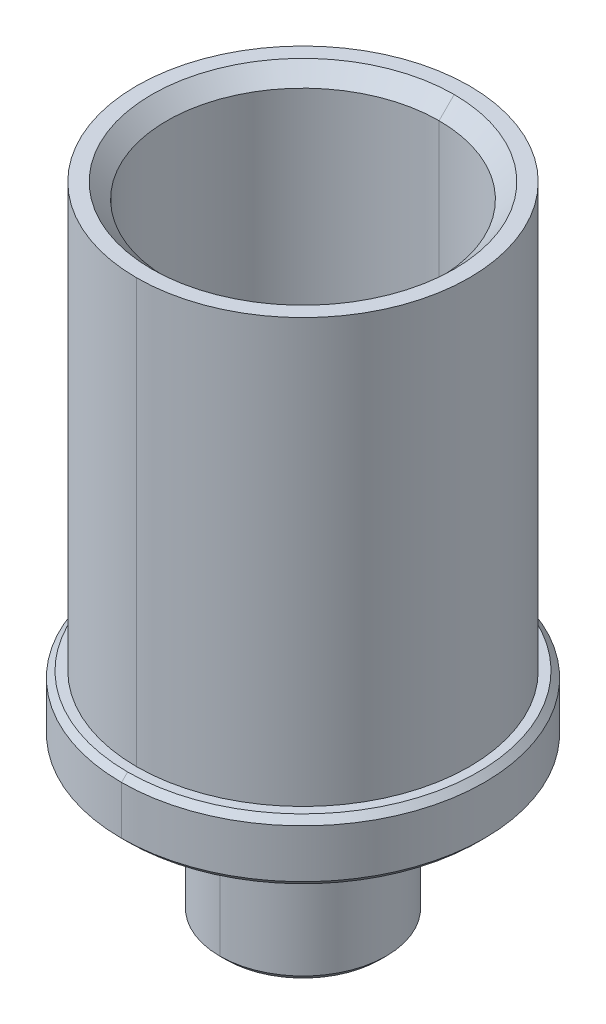
ISO-10303-21;
HEADER;
FILE_DESCRIPTION(('STEP AP214'),'2;1');
FILE_NAME('part.step','',(''),(''),'','','');
FILE_SCHEMA(('AUTOMOTIVE_DESIGN { 1 0 10303 214 1 1 1 1 }'));
ENDSEC;
DATA;
#1=APPLICATION_CONTEXT('core data for automotive mechanical design processes');
#2=APPLICATION_PROTOCOL_DEFINITION('international standard','automotive_design',2000,#1);
#3=PRODUCT_CONTEXT('',#1,'mechanical');
#4=PRODUCT('Part','Part','',(#3));
#5=PRODUCT_RELATED_PRODUCT_CATEGORY('part','',(#4));
#6=PRODUCT_DEFINITION_FORMATION('','',#4);
#7=PRODUCT_DEFINITION_CONTEXT('part definition',#1,'design');
#8=PRODUCT_DEFINITION('design','',#6,#7);
#9=PRODUCT_DEFINITION_SHAPE('','',#8);
#10=(LENGTH_UNIT() NAMED_UNIT(*) SI_UNIT(.MILLI.,.METRE.));
#11=(NAMED_UNIT(*) PLANE_ANGLE_UNIT() SI_UNIT($,.RADIAN.));
#12=(NAMED_UNIT(*) SI_UNIT($,.STERADIAN.) SOLID_ANGLE_UNIT());
#13=UNCERTAINTY_MEASURE_WITH_UNIT(LENGTH_MEASURE(1.E-05),#10,'distance_accuracy_value','');
#14=(GEOMETRIC_REPRESENTATION_CONTEXT(3) GLOBAL_UNCERTAINTY_ASSIGNED_CONTEXT((#13)) GLOBAL_UNIT_ASSIGNED_CONTEXT((#10,
#11,#12)) REPRESENTATION_CONTEXT('',''));
#15=CARTESIAN_POINT('',(0.,0.,0.));
#16=DIRECTION('',(0.,0.,1.));
#17=DIRECTION('',(1.,0.,0.));
#18=AXIS2_PLACEMENT_3D('',#15,#16,#17);
#19=CARTESIAN_POINT('',(0.,7.,0.));
#20=DIRECTION('',(0.,1.,0.));
#21=DIRECTION('',(0.,0.,1.));
#22=AXIS2_PLACEMENT_3D('',#19,#20,#21);
#23=CONICAL_SURFACE('',#22,2.5,0.785398163397448);
#24=DIRECTION('',(0.,0.707106781186548,-0.707106781186547));
#25=VECTOR('',#24,1.);
#26=CARTESIAN_POINT('',(0.,7.,-2.5));
#27=LINE('',#26,#25);
#28=CARTESIAN_POINT('',(0.,6.75,-2.25));
#29=VERTEX_POINT('',#28);
#30=CARTESIAN_POINT('',(0.,7.,-2.5));
#31=VERTEX_POINT('',#30);
#32=EDGE_CURVE('E159',#29,#31,#27,.T.);
#33=ORIENTED_EDGE('',*,*,#32,.F.);
#34=CARTESIAN_POINT('',(0.,6.75,0.));
#35=DIRECTION('',(0.,1.,0.));
#36=DIRECTION('',(0.,0.,-1.));
#37=AXIS2_PLACEMENT_3D('',#34,#35,#36);
#38=CIRCLE('',#37,2.25);
#39=CARTESIAN_POINT('',(0.,6.75,2.25));
#40=VERTEX_POINT('',#39);
#41=EDGE_CURVE('E136',#40,#29,#38,.T.);
#42=ORIENTED_EDGE('',*,*,#41,.F.);
#43=DIRECTION('',(0.,0.707106781186548,0.707106781186547));
#44=VECTOR('',#43,1.);
#45=CARTESIAN_POINT('',(0.,7.,2.5));
#46=LINE('',#45,#44);
#47=CARTESIAN_POINT('',(0.,7.,2.5));
#48=VERTEX_POINT('',#47);
#49=EDGE_CURVE('E168',#40,#48,#46,.T.);
#50=ORIENTED_EDGE('',*,*,#49,.T.);
#51=CARTESIAN_POINT('',(0.,7.,0.));
#52=DIRECTION('',(0.,-1.,0.));
#53=DIRECTION('',(0.,0.,-1.));
#54=AXIS2_PLACEMENT_3D('',#51,#52,#53);
#55=CIRCLE('',#54,2.5);
#56=EDGE_CURVE('E160',#31,#48,#55,.T.);
#57=ORIENTED_EDGE('',*,*,#56,.F.);
#58=EDGE_LOOP('',(#33,#42,#50,#57));
#59=FACE_BOUND('',#58,.T.);
#60=ADVANCED_FACE('F17',(#59),#23,.F.);
#61=CARTESIAN_POINT('',(0.,-0.1,0.));
#62=DIRECTION('',(0.,-1.,0.));
#63=DIRECTION('',(0.,0.,-1.));
#64=AXIS2_PLACEMENT_3D('',#61,#62,#63);
#65=CONICAL_SURFACE('',#64,3.,0.785398163397446);
#66=DIRECTION('',(0.,-0.707106781186549,0.707106781186546));
#67=VECTOR('',#66,1.);
#68=CARTESIAN_POINT('',(0.,-0.1,3.));
#69=LINE('',#68,#67);
#70=CARTESIAN_POINT('',(0.,0.,2.9));
#71=VERTEX_POINT('',#70);
#72=CARTESIAN_POINT('',(0.,-0.1,3.));
#73=VERTEX_POINT('',#72);
#74=EDGE_CURVE('E186',#71,#73,#69,.T.);
#75=ORIENTED_EDGE('',*,*,#74,.F.);
#76=CARTESIAN_POINT('',(0.,0.,0.));
#77=DIRECTION('',(0.,1.,0.));
#78=DIRECTION('',(0.,0.,-1.));
#79=AXIS2_PLACEMENT_3D('',#76,#77,#78);
#80=CIRCLE('',#79,2.9);
#81=CARTESIAN_POINT('',(0.,0.,-2.9));
#82=VERTEX_POINT('',#81);
#83=EDGE_CURVE('E233',#82,#71,#80,.T.);
#84=ORIENTED_EDGE('',*,*,#83,.F.);
#85=DIRECTION('',(0.,-0.707106781186549,-0.707106781186546));
#86=VECTOR('',#85,1.);
#87=CARTESIAN_POINT('',(0.,-0.1,-3.));
#88=LINE('',#87,#86);
#89=CARTESIAN_POINT('',(0.,-0.1,-3.));
#90=VERTEX_POINT('',#89);
#91=EDGE_CURVE('E174',#82,#90,#88,.T.);
#92=ORIENTED_EDGE('',*,*,#91,.T.);
#93=CARTESIAN_POINT('',(0.,-0.1,0.));
#94=DIRECTION('',(0.,-1.,0.));
#95=DIRECTION('',(0.,0.,-1.));
#96=AXIS2_PLACEMENT_3D('',#93,#94,#95);
#97=CIRCLE('',#96,3.);
#98=EDGE_CURVE('E229',#73,#90,#97,.T.);
#99=ORIENTED_EDGE('',*,*,#98,.F.);
#100=EDGE_LOOP('',(#75,#84,#92,#99));
#101=FACE_BOUND('',#100,.T.);
#102=ADVANCED_FACE('F19',(#101),#65,.T.);
#103=CARTESIAN_POINT('',(0.,-1.,0.));
#104=DIRECTION('',(0.,1.,0.));
#105=DIRECTION('',(0.,0.,1.));
#106=AXIS2_PLACEMENT_3D('',#103,#104,#105);
#107=CONICAL_SURFACE('',#106,2.9,0.785398163397446);
#108=DIRECTION('',(0.,0.707106781186549,-0.707106781186546));
#109=VECTOR('',#108,1.);
#110=CARTESIAN_POINT('',(0.,-1.,-2.9));
#111=LINE('',#110,#109);
#112=CARTESIAN_POINT('',(0.,-1.,-2.9));
#113=VERTEX_POINT('',#112);
#114=CARTESIAN_POINT('',(0.,-0.9,-3.));
#115=VERTEX_POINT('',#114);
#116=EDGE_CURVE('E198',#113,#115,#111,.T.);
#117=ORIENTED_EDGE('',*,*,#116,.F.);
#118=CARTESIAN_POINT('',(0.,-1.,0.));
#119=DIRECTION('',(0.,-1.,0.));
#120=DIRECTION('',(0.,0.,1.));
#121=AXIS2_PLACEMENT_3D('',#118,#119,#120);
#122=CIRCLE('',#121,2.9);
#123=CARTESIAN_POINT('',(0.,-1.,2.9));
#124=VERTEX_POINT('',#123);
#125=EDGE_CURVE('E284',#124,#113,#122,.T.);
#126=ORIENTED_EDGE('',*,*,#125,.F.);
#127=DIRECTION('',(0.,0.707106781186549,0.707106781186546));
#128=VECTOR('',#127,1.);
#129=CARTESIAN_POINT('',(0.,-1.,2.9));
#130=LINE('',#129,#128);
#131=CARTESIAN_POINT('',(0.,-0.9,3.));
#132=VERTEX_POINT('',#131);
#133=EDGE_CURVE('E206',#124,#132,#130,.T.);
#134=ORIENTED_EDGE('',*,*,#133,.T.);
#135=CARTESIAN_POINT('',(0.,-0.9,0.));
#136=DIRECTION('',(0.,1.,0.));
#137=DIRECTION('',(0.,0.,1.));
#138=AXIS2_PLACEMENT_3D('',#135,#136,#137);
#139=CIRCLE('',#138,3.);
#140=EDGE_CURVE('E232',#115,#132,#139,.T.);
#141=ORIENTED_EDGE('',*,*,#140,.F.);
#142=EDGE_LOOP('',(#117,#126,#134,#141));
#143=FACE_BOUND('',#142,.T.);
#144=ADVANCED_FACE('F301',(#143),#107,.T.);
#145=CARTESIAN_POINT('',(0.,-3.5,0.));
#146=DIRECTION('',(0.,1.,0.));
#147=DIRECTION('',(0.,0.,1.));
#148=AXIS2_PLACEMENT_3D('',#145,#146,#147);
#149=CONICAL_SURFACE('',#148,1.275,0.785398163397446);
#150=DIRECTION('',(0.,0.707106781186549,-0.707106781186546));
#151=VECTOR('',#150,1.);
#152=CARTESIAN_POINT('',(0.,-3.5,-1.275));
#153=LINE('',#152,#151);
#154=CARTESIAN_POINT('',(0.,-3.5,-1.275));
#155=VERTEX_POINT('',#154);
#156=CARTESIAN_POINT('',(0.,-3.4,-1.375));
#157=VERTEX_POINT('',#156);
#158=EDGE_CURVE('E207',#155,#157,#153,.T.);
#159=ORIENTED_EDGE('',*,*,#158,.F.);
#160=CARTESIAN_POINT('',(0.,-3.5,0.));
#161=DIRECTION('',(0.,-1.,0.));
#162=DIRECTION('',(0.,0.,1.));
#163=AXIS2_PLACEMENT_3D('',#160,#161,#162);
#164=CIRCLE('',#163,1.275);
#165=CARTESIAN_POINT('',(0.,-3.5,1.275));
#166=VERTEX_POINT('',#165);
#167=EDGE_CURVE('E11',#166,#155,#164,.T.);
#168=ORIENTED_EDGE('',*,*,#167,.F.);
#169=DIRECTION('',(0.,0.707106781186549,0.707106781186546));
#170=VECTOR('',#169,1.);
#171=CARTESIAN_POINT('',(0.,-3.5,1.275));
#172=LINE('',#171,#170);
#173=CARTESIAN_POINT('',(0.,-3.4,1.375));
#174=VERTEX_POINT('',#173);
#175=EDGE_CURVE('E218',#166,#174,#172,.T.);
#176=ORIENTED_EDGE('',*,*,#175,.T.);
#177=CARTESIAN_POINT('',(0.,-3.4,0.));
#178=DIRECTION('',(0.,1.,0.));
#179=DIRECTION('',(0.,0.,1.));
#180=AXIS2_PLACEMENT_3D('',#177,#178,#179);
#181=CIRCLE('',#180,1.375);
#182=EDGE_CURVE('E27',#157,#174,#181,.T.);
#183=ORIENTED_EDGE('',*,*,#182,.F.);
#184=EDGE_LOOP('',(#159,#168,#176,#183));
#185=FACE_BOUND('',#184,.T.);
#186=ADVANCED_FACE('F568',(#185),#149,.T.);
#187=CARTESIAN_POINT('',(-1.375,-3.5,0.));
#188=DIRECTION('',(0.,1.,0.));
#189=DIRECTION('',(1.,0.,0.));
#190=AXIS2_PLACEMENT_3D('',#187,#188,#189);
#191=PLANE('',#190);
#192=ORIENTED_EDGE('',*,*,#167,.T.);
#193=CARTESIAN_POINT('',(0.,-3.5,0.));
#194=DIRECTION('',(0.,-1.,0.));
#195=DIRECTION('',(0.,0.,1.));
#196=AXIS2_PLACEMENT_3D('',#193,#194,#195);
#197=CIRCLE('',#196,1.275);
#198=EDGE_CURVE('E212',#155,#166,#197,.T.);
#199=ORIENTED_EDGE('',*,*,#198,.T.);
#200=EDGE_LOOP('',(#192,#199));
#201=FACE_BOUND('',#200,.T.);
#202=ADVANCED_FACE('F318',(#201),#191,.F.);
#203=CARTESIAN_POINT('',(0.,-3.5,0.));
#204=DIRECTION('',(0.,-1.,0.));
#205=DIRECTION('',(0.,0.,-1.));
#206=AXIS2_PLACEMENT_3D('',#203,#204,#205);
#207=CYLINDRICAL_SURFACE('',#206,1.375);
#208=DIRECTION('',(0.,-1.,0.));
#209=VECTOR('',#208,1.);
#210=CARTESIAN_POINT('',(0.,-3.5,1.375));
#211=LINE('',#210,#209);
#212=CARTESIAN_POINT('',(0.,-1.,1.375));
#213=VERTEX_POINT('',#212);
#214=EDGE_CURVE('E237',#213,#174,#211,.T.);
#215=ORIENTED_EDGE('',*,*,#214,.F.);
#216=CARTESIAN_POINT('',(0.,-1.,0.));
#217=DIRECTION('',(0.,-1.,0.));
#218=DIRECTION('',(0.,0.,-1.));
#219=AXIS2_PLACEMENT_3D('',#216,#217,#218);
#220=CIRCLE('',#219,1.375);
#221=CARTESIAN_POINT('',(0.,-1.,-1.375));
#222=VERTEX_POINT('',#221);
#223=EDGE_CURVE('E21',#213,#222,#220,.T.);
#224=ORIENTED_EDGE('',*,*,#223,.T.);
#225=DIRECTION('',(0.,-1.,0.));
#226=VECTOR('',#225,1.);
#227=CARTESIAN_POINT('',(0.,-3.5,-1.375));
#228=LINE('',#227,#226);
#229=EDGE_CURVE('E241',#222,#157,#228,.T.);
#230=ORIENTED_EDGE('',*,*,#229,.T.);
#231=ORIENTED_EDGE('',*,*,#182,.T.);
#232=EDGE_LOOP('',(#215,#224,#230,#231));
#233=FACE_BOUND('',#232,.T.);
#234=ADVANCED_FACE('F308',(#233),#207,.T.);
#235=CARTESIAN_POINT('',(-3.,-1.,0.));
#236=DIRECTION('',(0.,1.,0.));
#237=DIRECTION('',(1.,0.,0.));
#238=AXIS2_PLACEMENT_3D('',#235,#236,#237);
#239=PLANE('',#238);
#240=CARTESIAN_POINT('',(0.,-1.,0.));
#241=DIRECTION('',(0.,-1.,0.));
#242=DIRECTION('',(0.,0.,-1.));
#243=AXIS2_PLACEMENT_3D('',#240,#241,#242);
#244=CIRCLE('',#243,1.375);
#245=EDGE_CURVE('E222',#222,#213,#244,.T.);
#246=ORIENTED_EDGE('',*,*,#245,.F.);
#247=ORIENTED_EDGE('',*,*,#223,.F.);
#248=EDGE_LOOP('',(#246,#247));
#249=FACE_BOUND('',#248,.T.);
#250=ORIENTED_EDGE('',*,*,#125,.T.);
#251=CARTESIAN_POINT('',(0.,-1.,0.));
#252=DIRECTION('',(0.,-1.,0.));
#253=DIRECTION('',(0.,0.,1.));
#254=AXIS2_PLACEMENT_3D('',#251,#252,#253);
#255=CIRCLE('',#254,2.9);
#256=EDGE_CURVE('E178',#113,#124,#255,.T.);
#257=ORIENTED_EDGE('',*,*,#256,.T.);
#258=EDGE_LOOP('',(#250,#257));
#259=FACE_BOUND('',#258,.T.);
#260=ADVANCED_FACE('F306',(#249,#259),#239,.F.);
#261=CARTESIAN_POINT('',(0.,-3.5,0.));
#262=DIRECTION('',(0.,-1.,0.));
#263=DIRECTION('',(0.,0.,-1.));
#264=AXIS2_PLACEMENT_3D('',#261,#262,#263);
#265=CYLINDRICAL_SURFACE('',#264,3.);
#266=DIRECTION('',(0.,-1.,0.));
#267=VECTOR('',#266,1.);
#268=CARTESIAN_POINT('',(0.,-3.5,3.));
#269=LINE('',#268,#267);
#270=EDGE_CURVE('E245',#73,#132,#269,.T.);
#271=ORIENTED_EDGE('',*,*,#270,.F.);
#272=ORIENTED_EDGE('',*,*,#98,.T.);
#273=DIRECTION('',(0.,-1.,0.));
#274=VECTOR('',#273,1.);
#275=CARTESIAN_POINT('',(0.,-3.5,-3.));
#276=LINE('',#275,#274);
#277=EDGE_CURVE('E249',#90,#115,#276,.T.);
#278=ORIENTED_EDGE('',*,*,#277,.T.);
#279=ORIENTED_EDGE('',*,*,#140,.T.);
#280=EDGE_LOOP('',(#271,#272,#278,#279));
#281=FACE_BOUND('',#280,.T.);
#282=ADVANCED_FACE('F292',(#281),#265,.T.);
#283=CARTESIAN_POINT('',(-2.75,0.,0.));
#284=DIRECTION('',(0.,-1.,0.));
#285=DIRECTION('',(0.,0.,-1.));
#286=AXIS2_PLACEMENT_3D('',#283,#284,#285);
#287=PLANE('',#286);
#288=CARTESIAN_POINT('',(0.,0.,0.));
#289=DIRECTION('',(0.,-1.,0.));
#290=DIRECTION('',(0.,0.,-1.));
#291=AXIS2_PLACEMENT_3D('',#288,#289,#290);
#292=CIRCLE('',#291,2.75);
#293=CARTESIAN_POINT('',(0.,0.,-2.75));
#294=VERTEX_POINT('',#293);
#295=CARTESIAN_POINT('',(0.,0.,2.75));
#296=VERTEX_POINT('',#295);
#297=EDGE_CURVE('E261',#294,#296,#292,.T.);
#298=ORIENTED_EDGE('',*,*,#297,.T.);
#299=CARTESIAN_POINT('',(0.,0.,0.));
#300=DIRECTION('',(0.,-1.,0.));
#301=DIRECTION('',(0.,0.,-1.));
#302=AXIS2_PLACEMENT_3D('',#299,#300,#301);
#303=CIRCLE('',#302,2.75);
#304=EDGE_CURVE('E278',#296,#294,#303,.T.);
#305=ORIENTED_EDGE('',*,*,#304,.T.);
#306=EDGE_LOOP('',(#298,#305));
#307=FACE_BOUND('',#306,.T.);
#308=ORIENTED_EDGE('',*,*,#83,.T.);
#309=CARTESIAN_POINT('',(0.,0.,0.));
#310=DIRECTION('',(0.,1.,0.));
#311=DIRECTION('',(0.,0.,-1.));
#312=AXIS2_PLACEMENT_3D('',#309,#310,#311);
#313=CIRCLE('',#312,2.9);
#314=EDGE_CURVE('E182',#71,#82,#313,.T.);
#315=ORIENTED_EDGE('',*,*,#314,.T.);
#316=EDGE_LOOP('',(#308,#315));
#317=FACE_BOUND('',#316,.T.);
#318=ADVANCED_FACE('F316',(#307,#317),#287,.F.);
#319=CARTESIAN_POINT('',(0.,-3.5,0.));
#320=DIRECTION('',(0.,-1.,0.));
#321=DIRECTION('',(0.,0.,-1.));
#322=AXIS2_PLACEMENT_3D('',#319,#320,#321);
#323=CYLINDRICAL_SURFACE('',#322,2.75);
#324=DIRECTION('',(0.,-1.,0.));
#325=VECTOR('',#324,1.);
#326=CARTESIAN_POINT('',(0.,-3.5,2.75));
#327=LINE('',#326,#325);
#328=CARTESIAN_POINT('',(0.,7.,2.75));
#329=VERTEX_POINT('',#328);
#330=EDGE_CURVE('E257',#329,#296,#327,.T.);
#331=ORIENTED_EDGE('',*,*,#330,.F.);
#332=CARTESIAN_POINT('',(0.,7.,0.));
#333=DIRECTION('',(0.,-1.,0.));
#334=DIRECTION('',(0.,0.,-1.));
#335=AXIS2_PLACEMENT_3D('',#332,#333,#334);
#336=CIRCLE('',#335,2.75);
#337=CARTESIAN_POINT('',(0.,7.,-2.75));
#338=VERTEX_POINT('',#337);
#339=EDGE_CURVE('E148',#329,#338,#336,.T.);
#340=ORIENTED_EDGE('',*,*,#339,.T.);
#341=DIRECTION('',(0.,-1.,0.));
#342=VECTOR('',#341,1.);
#343=CARTESIAN_POINT('',(0.,-3.5,-2.75));
#344=LINE('',#343,#342);
#345=EDGE_CURVE('E267',#338,#294,#344,.T.);
#346=ORIENTED_EDGE('',*,*,#345,.T.);
#347=ORIENTED_EDGE('',*,*,#304,.F.);
#348=EDGE_LOOP('',(#331,#340,#346,#347));
#349=FACE_BOUND('',#348,.T.);
#350=ADVANCED_FACE('F334',(#349),#323,.T.);
#351=CARTESIAN_POINT('',(-2.25,7.,0.));
#352=DIRECTION('',(0.,-1.,0.));
#353=DIRECTION('',(0.,0.,-1.));
#354=AXIS2_PLACEMENT_3D('',#351,#352,#353);
#355=PLANE('',#354);
#356=CARTESIAN_POINT('',(0.,7.,0.));
#357=DIRECTION('',(0.,-1.,0.));
#358=DIRECTION('',(0.,0.,-1.));
#359=AXIS2_PLACEMENT_3D('',#356,#357,#358);
#360=CIRCLE('',#359,2.5);
#361=EDGE_CURVE('E165',#48,#31,#360,.T.);
#362=ORIENTED_EDGE('',*,*,#361,.T.);
#363=ORIENTED_EDGE('',*,*,#56,.T.);
#364=EDGE_LOOP('',(#362,#363));
#365=FACE_BOUND('',#364,.T.);
#366=CARTESIAN_POINT('',(0.,7.,0.));
#367=DIRECTION('',(0.,-1.,0.));
#368=DIRECTION('',(0.,0.,-1.));
#369=AXIS2_PLACEMENT_3D('',#366,#367,#368);
#370=CIRCLE('',#369,2.75);
#371=EDGE_CURVE('E253',#338,#329,#370,.T.);
#372=ORIENTED_EDGE('',*,*,#371,.F.);
#373=ORIENTED_EDGE('',*,*,#339,.F.);
#374=EDGE_LOOP('',(#372,#373));
#375=FACE_BOUND('',#374,.T.);
#376=ADVANCED_FACE('F332',(#365,#375),#355,.F.);
#377=CARTESIAN_POINT('',(0.,-3.5,0.));
#378=DIRECTION('',(0.,-1.,0.));
#379=DIRECTION('',(0.,0.,-1.));
#380=AXIS2_PLACEMENT_3D('',#377,#378,#379);
#381=CYLINDRICAL_SURFACE('',#380,2.25);
#382=DIRECTION('',(0.,-1.,0.));
#383=VECTOR('',#382,1.);
#384=CARTESIAN_POINT('',(0.,-3.5,2.25));
#385=LINE('',#384,#383);
#386=CARTESIAN_POINT('',(0.,0.,2.25));
#387=VERTEX_POINT('',#386);
#388=EDGE_CURVE('E142',#40,#387,#385,.T.);
#389=ORIENTED_EDGE('',*,*,#388,.F.);
#390=ORIENTED_EDGE('',*,*,#41,.T.);
#391=DIRECTION('',(0.,-1.,0.));
#392=VECTOR('',#391,1.);
#393=CARTESIAN_POINT('',(0.,-3.5,-2.25));
#394=LINE('',#393,#392);
#395=CARTESIAN_POINT('',(0.,0.,-2.25));
#396=VERTEX_POINT('',#395);
#397=EDGE_CURVE('E139',#29,#396,#394,.T.);
#398=ORIENTED_EDGE('',*,*,#397,.T.);
#399=CARTESIAN_POINT('',(0.,0.,0.));
#400=DIRECTION('',(0.,-1.,0.));
#401=DIRECTION('',(0.,0.,-1.));
#402=AXIS2_PLACEMENT_3D('',#399,#400,#401);
#403=CIRCLE('',#402,2.25);
#404=EDGE_CURVE('E40',#396,#387,#403,.T.);
#405=ORIENTED_EDGE('',*,*,#404,.T.);
#406=EDGE_LOOP('',(#389,#390,#398,#405));
#407=FACE_BOUND('',#406,.T.);
#408=ADVANCED_FACE('F138',(#407),#381,.F.);
#409=CARTESIAN_POINT('',(0.,0.,0.));
#410=DIRECTION('',(0.,-1.,0.));
#411=DIRECTION('',(0.,0.,-1.));
#412=AXIS2_PLACEMENT_3D('',#409,#410,#411);
#413=PLANE('',#412);
#414=ORIENTED_EDGE('',*,*,#404,.F.);
#415=CARTESIAN_POINT('',(0.,0.,0.));
#416=DIRECTION('',(0.,-1.,0.));
#417=DIRECTION('',(0.,0.,-1.));
#418=AXIS2_PLACEMENT_3D('',#415,#416,#417);
#419=CIRCLE('',#418,2.25);
#420=EDGE_CURVE('E155',#387,#396,#419,.T.);
#421=ORIENTED_EDGE('',*,*,#420,.F.);
#422=EDGE_LOOP('',(#414,#421));
#423=FACE_BOUND('',#422,.T.);
#424=ADVANCED_FACE('F340',(#423),#413,.F.);
#425=CARTESIAN_POINT('',(0.,-3.5,0.));
#426=DIRECTION('',(0.,-1.,0.));
#427=DIRECTION('',(0.,0.,-1.));
#428=AXIS2_PLACEMENT_3D('',#425,#426,#427);
#429=CYLINDRICAL_SURFACE('',#428,2.25);
#430=CARTESIAN_POINT('',(0.,6.75,0.));
#431=DIRECTION('',(0.,1.,0.));
#432=DIRECTION('',(0.,0.,-1.));
#433=AXIS2_PLACEMENT_3D('',#430,#431,#432);
#434=CIRCLE('',#433,2.25);
#435=EDGE_CURVE('E154',#29,#40,#434,.T.);
#436=ORIENTED_EDGE('',*,*,#435,.T.);
#437=ORIENTED_EDGE('',*,*,#388,.T.);
#438=ORIENTED_EDGE('',*,*,#420,.T.);
#439=ORIENTED_EDGE('',*,*,#397,.F.);
#440=EDGE_LOOP('',(#436,#437,#438,#439));
#441=FACE_BOUND('',#440,.T.);
#442=ADVANCED_FACE('F152',(#441),#429,.F.);
#443=CARTESIAN_POINT('',(0.,-3.5,0.));
#444=DIRECTION('',(0.,-1.,0.));
#445=DIRECTION('',(0.,0.,-1.));
#446=AXIS2_PLACEMENT_3D('',#443,#444,#445);
#447=CYLINDRICAL_SURFACE('',#446,2.75);
#448=ORIENTED_EDGE('',*,*,#371,.T.);
#449=ORIENTED_EDGE('',*,*,#330,.T.);
#450=ORIENTED_EDGE('',*,*,#297,.F.);
#451=ORIENTED_EDGE('',*,*,#345,.F.);
#452=EDGE_LOOP('',(#448,#449,#450,#451));
#453=FACE_BOUND('',#452,.T.);
#454=ADVANCED_FACE('F348',(#453),#447,.T.);
#455=CARTESIAN_POINT('',(0.,-3.5,0.));
#456=DIRECTION('',(0.,-1.,0.));
#457=DIRECTION('',(0.,0.,-1.));
#458=AXIS2_PLACEMENT_3D('',#455,#456,#457);
#459=CYLINDRICAL_SURFACE('',#458,3.);
#460=CARTESIAN_POINT('',(0.,-0.1,0.));
#461=DIRECTION('',(0.,-1.,0.));
#462=DIRECTION('',(0.,0.,-1.));
#463=AXIS2_PLACEMENT_3D('',#460,#461,#462);
#464=CIRCLE('',#463,3.);
#465=EDGE_CURVE('E179',#90,#73,#464,.T.);
#466=ORIENTED_EDGE('',*,*,#465,.T.);
#467=ORIENTED_EDGE('',*,*,#270,.T.);
#468=CARTESIAN_POINT('',(0.,-0.9,0.));
#469=DIRECTION('',(0.,1.,0.));
#470=DIRECTION('',(0.,0.,1.));
#471=AXIS2_PLACEMENT_3D('',#468,#469,#470);
#472=CIRCLE('',#471,3.);
#473=EDGE_CURVE('E202',#132,#115,#472,.T.);
#474=ORIENTED_EDGE('',*,*,#473,.T.);
#475=ORIENTED_EDGE('',*,*,#277,.F.);
#476=EDGE_LOOP('',(#466,#467,#474,#475));
#477=FACE_BOUND('',#476,.T.);
#478=ADVANCED_FACE('F297',(#477),#459,.T.);
#479=CARTESIAN_POINT('',(0.,-3.5,0.));
#480=DIRECTION('',(0.,-1.,0.));
#481=DIRECTION('',(0.,0.,-1.));
#482=AXIS2_PLACEMENT_3D('',#479,#480,#481);
#483=CYLINDRICAL_SURFACE('',#482,1.375);
#484=ORIENTED_EDGE('',*,*,#245,.T.);
#485=ORIENTED_EDGE('',*,*,#214,.T.);
#486=CARTESIAN_POINT('',(0.,-3.4,0.));
#487=DIRECTION('',(0.,1.,0.));
#488=DIRECTION('',(0.,0.,1.));
#489=AXIS2_PLACEMENT_3D('',#486,#487,#488);
#490=CIRCLE('',#489,1.375);
#491=EDGE_CURVE('E211',#174,#157,#490,.T.);
#492=ORIENTED_EDGE('',*,*,#491,.T.);
#493=ORIENTED_EDGE('',*,*,#229,.F.);
#494=EDGE_LOOP('',(#484,#485,#492,#493));
#495=FACE_BOUND('',#494,.T.);
#496=ADVANCED_FACE('F370',(#495),#483,.T.);
#497=CARTESIAN_POINT('',(0.,-3.5,0.));
#498=DIRECTION('',(0.,1.,0.));
#499=DIRECTION('',(0.,0.,1.));
#500=AXIS2_PLACEMENT_3D('',#497,#498,#499);
#501=CONICAL_SURFACE('',#500,1.275,0.785398163397446);
#502=ORIENTED_EDGE('',*,*,#198,.F.);
#503=ORIENTED_EDGE('',*,*,#158,.T.);
#504=ORIENTED_EDGE('',*,*,#491,.F.);
#505=ORIENTED_EDGE('',*,*,#175,.F.);
#506=EDGE_LOOP('',(#502,#503,#504,#505));
#507=FACE_BOUND('',#506,.T.);
#508=ADVANCED_FACE('F366',(#507),#501,.T.);
#509=CARTESIAN_POINT('',(0.,-1.,0.));
#510=DIRECTION('',(0.,1.,0.));
#511=DIRECTION('',(0.,0.,1.));
#512=AXIS2_PLACEMENT_3D('',#509,#510,#511);
#513=CONICAL_SURFACE('',#512,2.9,0.785398163397446);
#514=ORIENTED_EDGE('',*,*,#256,.F.);
#515=ORIENTED_EDGE('',*,*,#116,.T.);
#516=ORIENTED_EDGE('',*,*,#473,.F.);
#517=ORIENTED_EDGE('',*,*,#133,.F.);
#518=EDGE_LOOP('',(#514,#515,#516,#517));
#519=FACE_BOUND('',#518,.T.);
#520=ADVANCED_FACE('F304',(#519),#513,.T.);
#521=CARTESIAN_POINT('',(0.,-0.1,0.));
#522=DIRECTION('',(0.,-1.,0.));
#523=DIRECTION('',(0.,0.,-1.));
#524=AXIS2_PLACEMENT_3D('',#521,#522,#523);
#525=CONICAL_SURFACE('',#524,3.,0.785398163397446);
#526=ORIENTED_EDGE('',*,*,#314,.F.);
#527=ORIENTED_EDGE('',*,*,#74,.T.);
#528=ORIENTED_EDGE('',*,*,#465,.F.);
#529=ORIENTED_EDGE('',*,*,#91,.F.);
#530=EDGE_LOOP('',(#526,#527,#528,#529));
#531=FACE_BOUND('',#530,.T.);
#532=ADVANCED_FACE('F358',(#531),#525,.T.);
#533=CARTESIAN_POINT('',(0.,7.,0.));
#534=DIRECTION('',(0.,1.,0.));
#535=DIRECTION('',(0.,0.,1.));
#536=AXIS2_PLACEMENT_3D('',#533,#534,#535);
#537=CONICAL_SURFACE('',#536,2.5,0.785398163397448);
#538=ORIENTED_EDGE('',*,*,#435,.F.);
#539=ORIENTED_EDGE('',*,*,#32,.T.);
#540=ORIENTED_EDGE('',*,*,#361,.F.);
#541=ORIENTED_EDGE('',*,*,#49,.F.);
#542=EDGE_LOOP('',(#538,#539,#540,#541));
#543=FACE_BOUND('',#542,.T.);
#544=ADVANCED_FACE('F167',(#543),#537,.F.);
#545=CLOSED_SHELL('',(#60,#102,#144,#186,#202,#234,#260,#282,#318,#350,#376,#408,#424,#442,#454,
#478,#496,#508,#520,#532,#544));
#546=MANIFOLD_SOLID_BREP('B1',#545);
#547=ADVANCED_BREP_SHAPE_REPRESENTATION('',(#18,#546),#14);
#548=SHAPE_DEFINITION_REPRESENTATION(#9,#547);
ENDSEC;
END-ISO-10303-21;
